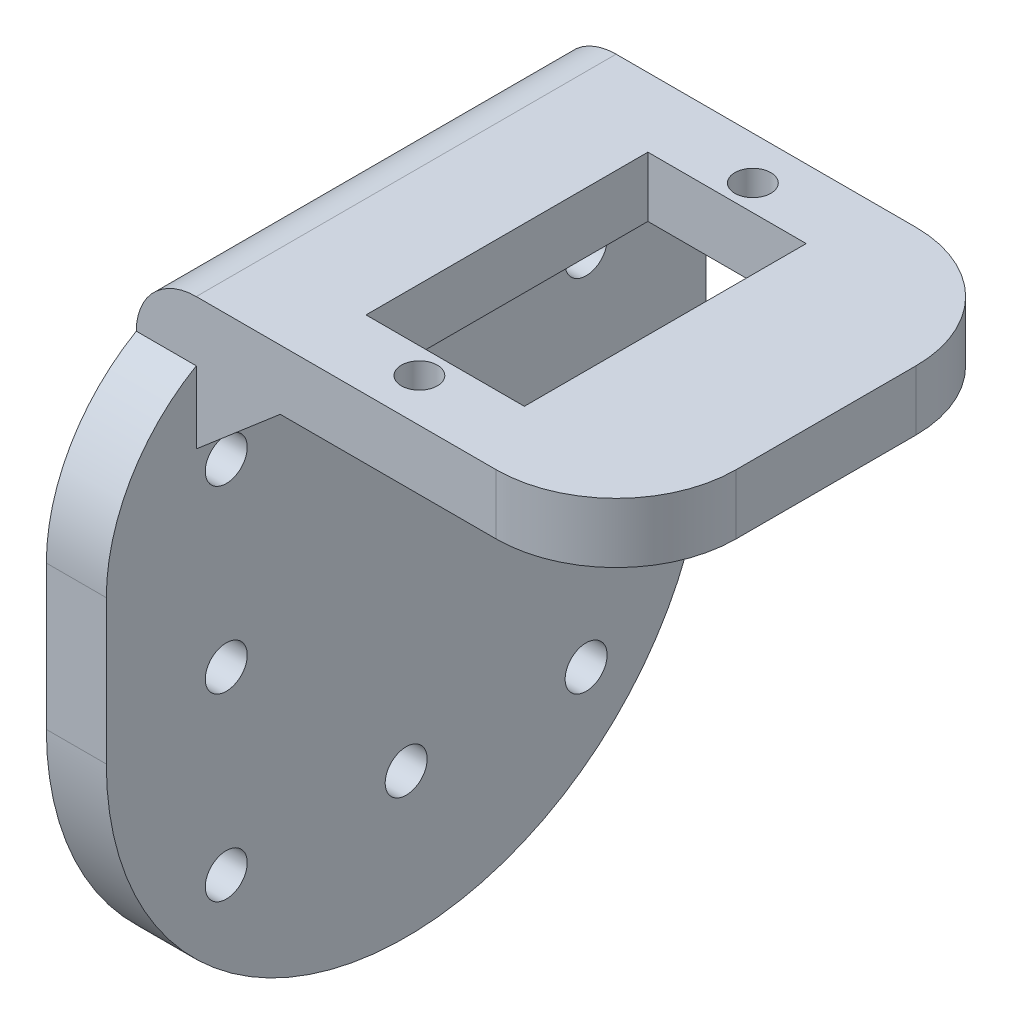
ISO-10303-21;
HEADER;
FILE_DESCRIPTION(('STEP AP214'),'2;1');
FILE_NAME('part.step','',(''),(''),'','','');
FILE_SCHEMA(('AUTOMOTIVE_DESIGN { 1 0 10303 214 1 1 1 1 }'));
ENDSEC;
DATA;
#1=APPLICATION_CONTEXT('core data for automotive mechanical design processes');
#2=APPLICATION_PROTOCOL_DEFINITION('international standard','automotive_design',2000,#1);
#3=PRODUCT_CONTEXT('',#1,'mechanical');
#4=PRODUCT('Part','Part','',(#3));
#5=PRODUCT_RELATED_PRODUCT_CATEGORY('part','',(#4));
#6=PRODUCT_DEFINITION_FORMATION('','',#4);
#7=PRODUCT_DEFINITION_CONTEXT('part definition',#1,'design');
#8=PRODUCT_DEFINITION('design','',#6,#7);
#9=PRODUCT_DEFINITION_SHAPE('','',#8);
#10=(LENGTH_UNIT() NAMED_UNIT(*) SI_UNIT(.MILLI.,.METRE.));
#11=(NAMED_UNIT(*) PLANE_ANGLE_UNIT() SI_UNIT($,.RADIAN.));
#12=(NAMED_UNIT(*) SI_UNIT($,.STERADIAN.) SOLID_ANGLE_UNIT());
#13=UNCERTAINTY_MEASURE_WITH_UNIT(LENGTH_MEASURE(1.E-05),#10,'distance_accuracy_value','');
#14=(GEOMETRIC_REPRESENTATION_CONTEXT(3) GLOBAL_UNCERTAINTY_ASSIGNED_CONTEXT((#13)) GLOBAL_UNIT_ASSIGNED_CONTEXT((#10,
#11,#12)) REPRESENTATION_CONTEXT('',''));
#15=CARTESIAN_POINT('',(0.,0.,0.));
#16=DIRECTION('',(0.,0.,1.));
#17=DIRECTION('',(1.,0.,0.));
#18=AXIS2_PLACEMENT_3D('',#15,#16,#17);
#19=CARTESIAN_POINT('',(5.,0.,0.));
#20=DIRECTION('',(1.,0.,0.));
#21=DIRECTION('',(0.,0.,-1.));
#22=AXIS2_PLACEMENT_3D('',#19,#20,#21);
#23=PLANE('',#22);
#24=CARTESIAN_POINT('',(5.,4.5,0.));
#25=DIRECTION('',(1.,0.,0.));
#26=DIRECTION('',(0.,0.,-1.));
#27=AXIS2_PLACEMENT_3D('',#24,#25,#26);
#28=CIRCLE('',#27,1.75);
#29=CARTESIAN_POINT('',(5.,4.5,-1.75));
#30=VERTEX_POINT('',#29);
#31=EDGE_CURVE('E303',#30,#30,#28,.T.);
#32=ORIENTED_EDGE('',*,*,#31,.F.);
#33=EDGE_LOOP('',(#32));
#34=FACE_BOUND('',#33,.T.);
#35=CARTESIAN_POINT('',(5.,4.5,15.));
#36=DIRECTION('',(1.,0.,0.));
#37=DIRECTION('',(0.,0.,-1.));
#38=AXIS2_PLACEMENT_3D('',#35,#36,#37);
#39=CIRCLE('',#38,1.75);
#40=CARTESIAN_POINT('',(5.,4.5,13.25));
#41=VERTEX_POINT('',#40);
#42=EDGE_CURVE('E304',#41,#41,#39,.T.);
#43=ORIENTED_EDGE('',*,*,#42,.F.);
#44=EDGE_LOOP('',(#43));
#45=FACE_BOUND('',#44,.T.);
#46=CARTESIAN_POINT('',(5.,-10.5,-15.));
#47=DIRECTION('',(1.,0.,0.));
#48=DIRECTION('',(0.,0.,-1.));
#49=AXIS2_PLACEMENT_3D('',#46,#47,#48);
#50=CIRCLE('',#49,1.75);
#51=CARTESIAN_POINT('',(5.,-10.5,-16.75));
#52=VERTEX_POINT('',#51);
#53=EDGE_CURVE('E311',#52,#52,#50,.T.);
#54=ORIENTED_EDGE('',*,*,#53,.F.);
#55=EDGE_LOOP('',(#54));
#56=FACE_BOUND('',#55,.T.);
#57=CARTESIAN_POINT('',(5.,-25.5,0.));
#58=DIRECTION('',(1.,0.,0.));
#59=DIRECTION('',(0.,0.,-1.));
#60=AXIS2_PLACEMENT_3D('',#57,#58,#59);
#61=CIRCLE('',#60,1.75);
#62=CARTESIAN_POINT('',(5.,-25.5,-1.75));
#63=VERTEX_POINT('',#62);
#64=EDGE_CURVE('E317',#63,#63,#61,.T.);
#65=ORIENTED_EDGE('',*,*,#64,.F.);
#66=EDGE_LOOP('',(#65));
#67=FACE_BOUND('',#66,.T.);
#68=CARTESIAN_POINT('',(5.,-10.5,15.));
#69=DIRECTION('',(1.,0.,0.));
#70=DIRECTION('',(0.,0.,-1.));
#71=AXIS2_PLACEMENT_3D('',#68,#69,#70);
#72=CIRCLE('',#71,1.75);
#73=CARTESIAN_POINT('',(5.,-10.5,13.25));
#74=VERTEX_POINT('',#73);
#75=EDGE_CURVE('E285',#74,#74,#72,.T.);
#76=ORIENTED_EDGE('',*,*,#75,.F.);
#77=EDGE_LOOP('',(#76));
#78=FACE_BOUND('',#77,.T.);
#79=CARTESIAN_POINT('',(5.,-25.5,15.));
#80=DIRECTION('',(1.,0.,0.));
#81=DIRECTION('',(0.,0.,-1.));
#82=AXIS2_PLACEMENT_3D('',#79,#80,#81);
#83=CIRCLE('',#82,1.75);
#84=CARTESIAN_POINT('',(5.,-25.5,13.25));
#85=VERTEX_POINT('',#84);
#86=EDGE_CURVE('E286',#85,#85,#83,.T.);
#87=ORIENTED_EDGE('',*,*,#86,.F.);
#88=EDGE_LOOP('',(#87));
#89=FACE_BOUND('',#88,.T.);
#90=CARTESIAN_POINT('',(5.,-25.5,-15.));
#91=DIRECTION('',(1.,0.,0.));
#92=DIRECTION('',(0.,0.,-1.));
#93=AXIS2_PLACEMENT_3D('',#90,#91,#92);
#94=CIRCLE('',#93,1.75);
#95=CARTESIAN_POINT('',(5.,-25.5,-16.75));
#96=VERTEX_POINT('',#95);
#97=EDGE_CURVE('E293',#96,#96,#94,.T.);
#98=ORIENTED_EDGE('',*,*,#97,.F.);
#99=EDGE_LOOP('',(#98));
#100=FACE_BOUND('',#99,.T.);
#101=CARTESIAN_POINT('',(5.,4.5,-15.));
#102=DIRECTION('',(1.,0.,0.));
#103=DIRECTION('',(0.,0.,-1.));
#104=AXIS2_PLACEMENT_3D('',#101,#102,#103);
#105=CIRCLE('',#104,1.75);
#106=CARTESIAN_POINT('',(5.,4.5,-16.75));
#107=VERTEX_POINT('',#106);
#108=EDGE_CURVE('E307',#107,#107,#105,.T.);
#109=ORIENTED_EDGE('',*,*,#108,.F.);
#110=EDGE_LOOP('',(#109));
#111=FACE_BOUND('',#110,.T.);
#112=DIRECTION('',(0.,0.,1.));
#113=VECTOR('',#112,1.);
#114=CARTESIAN_POINT('',(5.,12.5,0.));
#115=LINE('',#114,#113);
#116=CARTESIAN_POINT('',(5.,12.5,-11.5));
#117=VERTEX_POINT('',#116);
#118=CARTESIAN_POINT('',(5.,12.5,11.5));
#119=VERTEX_POINT('',#118);
#120=EDGE_CURVE('E338',#117,#119,#115,.T.);
#121=ORIENTED_EDGE('',*,*,#120,.T.);
#122=DIRECTION('',(0.,1.,0.));
#123=VECTOR('',#122,1.);
#124=CARTESIAN_POINT('',(5.,6.5,11.5));
#125=LINE('',#124,#123);
#126=CARTESIAN_POINT('',(5.,6.5,11.5));
#127=VERTEX_POINT('',#126);
#128=EDGE_CURVE('E179',#127,#119,#125,.T.);
#129=ORIENTED_EDGE('',*,*,#128,.F.);
#130=DIRECTION('',(0.,0.,1.));
#131=VECTOR('',#130,1.);
#132=CARTESIAN_POINT('',(5.,6.5,11.5));
#133=LINE('',#132,#131);
#134=CARTESIAN_POINT('',(5.,6.5,17.5));
#135=VERTEX_POINT('',#134);
#136=EDGE_CURVE('E190',#127,#135,#133,.T.);
#137=ORIENTED_EDGE('',*,*,#136,.T.);
#138=DIRECTION('',(0.,1.,0.));
#139=VECTOR('',#138,1.);
#140=CARTESIAN_POINT('',(5.,6.5,17.5));
#141=LINE('',#140,#139);
#142=CARTESIAN_POINT('',(5.,12.5,17.5));
#143=VERTEX_POINT('',#142);
#144=EDGE_CURVE('E191',#135,#143,#141,.T.);
#145=ORIENTED_EDGE('',*,*,#144,.T.);
#146=CARTESIAN_POINT('',(5.,-0.490381056766588,10.));
#147=DIRECTION('',(1.,0.,0.));
#148=DIRECTION('',(0.,0.,-1.));
#149=AXIS2_PLACEMENT_3D('',#146,#147,#148);
#150=CIRCLE('',#149,15.);
#151=CARTESIAN_POINT('',(5.,-0.490381056766588,25.));
#152=VERTEX_POINT('',#151);
#153=EDGE_CURVE('E45',#143,#152,#150,.T.);
#154=ORIENTED_EDGE('',*,*,#153,.T.);
#155=DIRECTION('',(0.,1.,0.));
#156=VECTOR('',#155,1.);
#157=CARTESIAN_POINT('',(5.,0.,25.));
#158=LINE('',#157,#156);
#159=CARTESIAN_POINT('',(5.,-12.5,25.));
#160=VERTEX_POINT('',#159);
#161=EDGE_CURVE('E330',#160,#152,#158,.T.);
#162=ORIENTED_EDGE('',*,*,#161,.F.);
#163=CARTESIAN_POINT('',(5.,-12.5,0.));
#164=DIRECTION('',(1.,0.,0.));
#165=DIRECTION('',(0.,0.,-1.));
#166=AXIS2_PLACEMENT_3D('',#163,#164,#165);
#167=CIRCLE('',#166,25.);
#168=CARTESIAN_POINT('',(5.,-12.5,-25.));
#169=VERTEX_POINT('',#168);
#170=EDGE_CURVE('E333',#160,#169,#167,.T.);
#171=ORIENTED_EDGE('',*,*,#170,.T.);
#172=DIRECTION('',(0.,1.,0.));
#173=VECTOR('',#172,1.);
#174=CARTESIAN_POINT('',(5.,0.,-25.));
#175=LINE('',#174,#173);
#176=CARTESIAN_POINT('',(5.,-0.490381056766574,-25.));
#177=VERTEX_POINT('',#176);
#178=EDGE_CURVE('E336',#169,#177,#175,.T.);
#179=ORIENTED_EDGE('',*,*,#178,.T.);
#180=CARTESIAN_POINT('',(5.,-0.490381056766574,-9.99999999999999));
#181=DIRECTION('',(1.,0.,0.));
#182=DIRECTION('',(0.,0.,-1.));
#183=AXIS2_PLACEMENT_3D('',#180,#181,#182);
#184=CIRCLE('',#183,15.);
#185=CARTESIAN_POINT('',(5.,12.5,-17.5));
#186=VERTEX_POINT('',#185);
#187=EDGE_CURVE('E387',#177,#186,#184,.T.);
#188=ORIENTED_EDGE('',*,*,#187,.T.);
#189=DIRECTION('',(0.,1.,0.));
#190=VECTOR('',#189,1.);
#191=CARTESIAN_POINT('',(5.,6.5,-17.5));
#192=LINE('',#191,#190);
#193=CARTESIAN_POINT('',(5.,6.5,-17.5));
#194=VERTEX_POINT('',#193);
#195=EDGE_CURVE('E206',#194,#186,#192,.T.);
#196=ORIENTED_EDGE('',*,*,#195,.F.);
#197=DIRECTION('',(0.,0.,-1.));
#198=VECTOR('',#197,1.);
#199=CARTESIAN_POINT('',(5.,6.5,-11.5));
#200=LINE('',#199,#198);
#201=CARTESIAN_POINT('',(5.,6.5,-11.5));
#202=VERTEX_POINT('',#201);
#203=EDGE_CURVE('E212',#202,#194,#200,.T.);
#204=ORIENTED_EDGE('',*,*,#203,.F.);
#205=DIRECTION('',(0.,1.,0.));
#206=VECTOR('',#205,1.);
#207=CARTESIAN_POINT('',(5.,6.5,-11.5));
#208=LINE('',#207,#206);
#209=EDGE_CURVE('E205',#202,#117,#208,.T.);
#210=ORIENTED_EDGE('',*,*,#209,.T.);
#211=EDGE_LOOP('',(#121,#129,#137,#145,#154,#162,#171,#179,#188,#196,#204,#210));
#212=FACE_BOUND('',#211,.T.);
#213=ADVANCED_FACE('F37',(#34,#45,#56,#67,#78,#89,#100,#111,#212),#23,.T.);
#214=CARTESIAN_POINT('',(0.,12.5,0.));
#215=DIRECTION('',(0.,1.,0.));
#216=DIRECTION('',(0.,0.,1.));
#217=AXIS2_PLACEMENT_3D('',#214,#215,#216);
#218=PLANE('',#217);
#219=CARTESIAN_POINT('',(20.,12.5,13.9));
#220=DIRECTION('',(0.,1.,0.));
#221=DIRECTION('',(0.,0.,1.));
#222=AXIS2_PLACEMENT_3D('',#219,#220,#221);
#223=CIRCLE('',#222,1.5);
#224=CARTESIAN_POINT('',(20.,12.5,15.4));
#225=VERTEX_POINT('',#224);
#226=EDGE_CURVE('E231',#225,#225,#223,.F.);
#227=ORIENTED_EDGE('',*,*,#226,.F.);
#228=EDGE_LOOP('',(#227));
#229=FACE_BOUND('',#228,.T.);
#230=DIRECTION('',(0.,0.,-1.));
#231=VECTOR('',#230,1.);
#232=CARTESIAN_POINT('',(13.4,12.5,-11.75));
#233=LINE('',#232,#231);
#234=CARTESIAN_POINT('',(13.4,12.5,11.75));
#235=VERTEX_POINT('',#234);
#236=CARTESIAN_POINT('',(13.4,12.5,-11.75));
#237=VERTEX_POINT('',#236);
#238=EDGE_CURVE('E230',#235,#237,#233,.T.);
#239=ORIENTED_EDGE('',*,*,#238,.F.);
#240=DIRECTION('',(-1.,0.,0.));
#241=VECTOR('',#240,1.);
#242=CARTESIAN_POINT('',(26.6,12.5,11.75));
#243=LINE('',#242,#241);
#244=CARTESIAN_POINT('',(26.6,12.5,11.75));
#245=VERTEX_POINT('',#244);
#246=EDGE_CURVE('E234',#245,#235,#243,.T.);
#247=ORIENTED_EDGE('',*,*,#246,.F.);
#248=DIRECTION('',(0.,0.,1.));
#249=VECTOR('',#248,1.);
#250=CARTESIAN_POINT('',(26.6,12.5,-11.75));
#251=LINE('',#250,#249);
#252=CARTESIAN_POINT('',(26.6,12.5,-11.75));
#253=VERTEX_POINT('',#252);
#254=EDGE_CURVE('E225',#253,#245,#251,.T.);
#255=ORIENTED_EDGE('',*,*,#254,.F.);
#256=DIRECTION('',(1.,0.,0.));
#257=VECTOR('',#256,1.);
#258=CARTESIAN_POINT('',(26.6,12.5,-11.75));
#259=LINE('',#258,#257);
#260=EDGE_CURVE('E228',#237,#253,#259,.T.);
#261=ORIENTED_EDGE('',*,*,#260,.F.);
#262=EDGE_LOOP('',(#239,#247,#255,#261));
#263=FACE_BOUND('',#262,.T.);
#264=CARTESIAN_POINT('',(20.,12.5,-13.9));
#265=DIRECTION('',(0.,1.,0.));
#266=DIRECTION('',(0.,0.,1.));
#267=AXIS2_PLACEMENT_3D('',#264,#265,#266);
#268=CIRCLE('',#267,1.5);
#269=CARTESIAN_POINT('',(20.,12.5,-12.4));
#270=VERTEX_POINT('',#269);
#271=EDGE_CURVE('E224',#270,#270,#268,.F.);
#272=ORIENTED_EDGE('',*,*,#271,.F.);
#273=EDGE_LOOP('',(#272));
#274=FACE_BOUND('',#273,.T.);
#275=DIRECTION('',(0.,0.,1.));
#276=VECTOR('',#275,1.);
#277=CARTESIAN_POINT('',(12.,12.5,11.5));
#278=LINE('',#277,#276);
#279=CARTESIAN_POINT('',(12.,12.5,11.5));
#280=VERTEX_POINT('',#279);
#281=CARTESIAN_POINT('',(12.,12.5,17.5));
#282=VERTEX_POINT('',#281);
#283=EDGE_CURVE('E187',#280,#282,#278,.T.);
#284=ORIENTED_EDGE('',*,*,#283,.F.);
#285=DIRECTION('',(1.,0.,0.));
#286=VECTOR('',#285,1.);
#287=CARTESIAN_POINT('',(5.,12.5,11.5));
#288=LINE('',#287,#286);
#289=EDGE_CURVE('E173',#119,#280,#288,.T.);
#290=ORIENTED_EDGE('',*,*,#289,.F.);
#291=ORIENTED_EDGE('',*,*,#120,.F.);
#292=DIRECTION('',(1.,0.,0.));
#293=VECTOR('',#292,1.);
#294=CARTESIAN_POINT('',(5.,12.5,-11.5));
#295=LINE('',#294,#293);
#296=CARTESIAN_POINT('',(12.,12.5,-11.5));
#297=VERTEX_POINT('',#296);
#298=EDGE_CURVE('E209',#117,#297,#295,.T.);
#299=ORIENTED_EDGE('',*,*,#298,.T.);
#300=DIRECTION('',(0.,0.,-1.));
#301=VECTOR('',#300,1.);
#302=CARTESIAN_POINT('',(12.,12.5,-11.5));
#303=LINE('',#302,#301);
#304=CARTESIAN_POINT('',(12.,12.5,-17.5));
#305=VERTEX_POINT('',#304);
#306=EDGE_CURVE('E216',#297,#305,#303,.T.);
#307=ORIENTED_EDGE('',*,*,#306,.T.);
#308=DIRECTION('',(-1.,0.,0.));
#309=VECTOR('',#308,1.);
#310=CARTESIAN_POINT('',(0.,12.5,-17.5));
#311=LINE('',#310,#309);
#312=CARTESIAN_POINT('',(30.,12.5,-17.5));
#313=VERTEX_POINT('',#312);
#314=EDGE_CURVE('E266',#313,#305,#311,.T.);
#315=ORIENTED_EDGE('',*,*,#314,.F.);
#316=CARTESIAN_POINT('',(30.,12.5,-7.5));
#317=DIRECTION('',(0.,1.,0.));
#318=DIRECTION('',(0.,0.,1.));
#319=AXIS2_PLACEMENT_3D('',#316,#317,#318);
#320=CIRCLE('',#319,10.);
#321=CARTESIAN_POINT('',(40.,12.5,-7.5));
#322=VERTEX_POINT('',#321);
#323=EDGE_CURVE('E355',#313,#322,#320,.F.);
#324=ORIENTED_EDGE('',*,*,#323,.T.);
#325=DIRECTION('',(0.,0.,-1.));
#326=VECTOR('',#325,1.);
#327=CARTESIAN_POINT('',(40.,12.5,-17.5));
#328=LINE('',#327,#326);
#329=CARTESIAN_POINT('',(40.,12.5,7.5));
#330=VERTEX_POINT('',#329);
#331=EDGE_CURVE('E276',#330,#322,#328,.T.);
#332=ORIENTED_EDGE('',*,*,#331,.F.);
#333=CARTESIAN_POINT('',(30.,12.5,7.5));
#334=DIRECTION('',(0.,1.,0.));
#335=DIRECTION('',(0.,0.,1.));
#336=AXIS2_PLACEMENT_3D('',#333,#334,#335);
#337=CIRCLE('',#336,10.);
#338=CARTESIAN_POINT('',(30.,12.5,17.5));
#339=VERTEX_POINT('',#338);
#340=EDGE_CURVE('E353',#330,#339,#337,.F.);
#341=ORIENTED_EDGE('',*,*,#340,.T.);
#342=DIRECTION('',(1.,0.,0.));
#343=VECTOR('',#342,1.);
#344=CARTESIAN_POINT('',(0.,12.5,17.5));
#345=LINE('',#344,#343);
#346=EDGE_CURVE('E195',#282,#339,#345,.T.);
#347=ORIENTED_EDGE('',*,*,#346,.F.);
#348=EDGE_LOOP('',(#284,#290,#291,#299,#307,#315,#324,#332,#341,#347));
#349=FACE_BOUND('',#348,.T.);
#350=ADVANCED_FACE('F193',(#229,#263,#274,#349),#218,.F.);
#351=CARTESIAN_POINT('',(5.,0.,25.));
#352=DIRECTION('',(0.,0.,1.));
#353=DIRECTION('',(1.,0.,0.));
#354=AXIS2_PLACEMENT_3D('',#351,#352,#353);
#355=PLANE('',#354);
#356=ORIENTED_EDGE('',*,*,#161,.T.);
#357=DIRECTION('',(-1.,0.,0.));
#358=VECTOR('',#357,1.);
#359=CARTESIAN_POINT('',(0.,-0.490381056766588,25.));
#360=LINE('',#359,#358);
#361=CARTESIAN_POINT('',(0.,-0.490381056766588,25.));
#362=VERTEX_POINT('',#361);
#363=EDGE_CURVE('E380',#152,#362,#360,.T.);
#364=ORIENTED_EDGE('',*,*,#363,.T.);
#365=DIRECTION('',(0.,1.,0.));
#366=VECTOR('',#365,1.);
#367=CARTESIAN_POINT('',(0.,0.,25.));
#368=LINE('',#367,#366);
#369=CARTESIAN_POINT('',(0.,-12.5,25.));
#370=VERTEX_POINT('',#369);
#371=EDGE_CURVE('E329',#370,#362,#368,.T.);
#372=ORIENTED_EDGE('',*,*,#371,.F.);
#373=DIRECTION('',(-1.,0.,0.));
#374=VECTOR('',#373,1.);
#375=CARTESIAN_POINT('',(5.,-12.5,25.));
#376=LINE('',#375,#374);
#377=EDGE_CURVE('E348',#160,#370,#376,.T.);
#378=ORIENTED_EDGE('',*,*,#377,.F.);
#379=EDGE_LOOP('',(#356,#364,#372,#378));
#380=FACE_BOUND('',#379,.T.);
#381=ADVANCED_FACE('F396',(#380),#355,.T.);
#382=CARTESIAN_POINT('',(5.,-12.5,0.));
#383=DIRECTION('',(-1.,0.,0.));
#384=DIRECTION('',(0.,0.,1.));
#385=AXIS2_PLACEMENT_3D('',#382,#383,#384);
#386=CYLINDRICAL_SURFACE('',#385,25.);
#387=CARTESIAN_POINT('',(0.,-12.5,0.));
#388=DIRECTION('',(1.,0.,0.));
#389=DIRECTION('',(0.,0.,-1.));
#390=AXIS2_PLACEMENT_3D('',#387,#388,#389);
#391=CIRCLE('',#390,25.);
#392=CARTESIAN_POINT('',(0.,-12.5,-25.));
#393=VERTEX_POINT('',#392);
#394=EDGE_CURVE('E343',#370,#393,#391,.T.);
#395=ORIENTED_EDGE('',*,*,#394,.T.);
#396=DIRECTION('',(-1.,0.,0.));
#397=VECTOR('',#396,1.);
#398=CARTESIAN_POINT('',(5.,-12.5,-25.));
#399=LINE('',#398,#397);
#400=EDGE_CURVE('E340',#169,#393,#399,.T.);
#401=ORIENTED_EDGE('',*,*,#400,.F.);
#402=ORIENTED_EDGE('',*,*,#170,.F.);
#403=ORIENTED_EDGE('',*,*,#377,.T.);
#404=EDGE_LOOP('',(#395,#401,#402,#403));
#405=FACE_BOUND('',#404,.T.);
#406=ADVANCED_FACE('F438',(#405),#386,.T.);
#407=CARTESIAN_POINT('',(5.,0.,-25.));
#408=DIRECTION('',(0.,0.,1.));
#409=DIRECTION('',(1.,0.,0.));
#410=AXIS2_PLACEMENT_3D('',#407,#408,#409);
#411=PLANE('',#410);
#412=DIRECTION('',(0.,1.,0.));
#413=VECTOR('',#412,1.);
#414=CARTESIAN_POINT('',(0.,0.,-25.));
#415=LINE('',#414,#413);
#416=CARTESIAN_POINT('',(0.,-0.490381056766574,-25.));
#417=VERTEX_POINT('',#416);
#418=EDGE_CURVE('E334',#393,#417,#415,.T.);
#419=ORIENTED_EDGE('',*,*,#418,.T.);
#420=DIRECTION('',(-1.,0.,0.));
#421=VECTOR('',#420,1.);
#422=CARTESIAN_POINT('',(5.,-0.490381056766574,-25.));
#423=LINE('',#422,#421);
#424=EDGE_CURVE('E11',#417,#177,#423,.F.);
#425=ORIENTED_EDGE('',*,*,#424,.T.);
#426=ORIENTED_EDGE('',*,*,#178,.F.);
#427=ORIENTED_EDGE('',*,*,#400,.T.);
#428=EDGE_LOOP('',(#419,#425,#426,#427));
#429=FACE_BOUND('',#428,.T.);
#430=ADVANCED_FACE('F435',(#429),#411,.F.);
#431=CARTESIAN_POINT('',(0.,0.,0.));
#432=DIRECTION('',(1.,0.,0.));
#433=DIRECTION('',(0.,0.,-1.));
#434=AXIS2_PLACEMENT_3D('',#431,#432,#433);
#435=PLANE('',#434);
#436=CARTESIAN_POINT('',(0.,4.5,0.));
#437=DIRECTION('',(1.,0.,0.));
#438=DIRECTION('',(0.,0.,-1.));
#439=AXIS2_PLACEMENT_3D('',#436,#437,#438);
#440=CIRCLE('',#439,1.75);
#441=CARTESIAN_POINT('',(0.,4.5,-1.75));
#442=VERTEX_POINT('',#441);
#443=EDGE_CURVE('E300',#442,#442,#440,.F.);
#444=ORIENTED_EDGE('',*,*,#443,.F.);
#445=EDGE_LOOP('',(#444));
#446=FACE_BOUND('',#445,.T.);
#447=CARTESIAN_POINT('',(0.,4.5,15.));
#448=DIRECTION('',(1.,0.,0.));
#449=DIRECTION('',(0.,0.,-1.));
#450=AXIS2_PLACEMENT_3D('',#447,#448,#449);
#451=CIRCLE('',#450,1.75);
#452=CARTESIAN_POINT('',(0.,4.5,13.25));
#453=VERTEX_POINT('',#452);
#454=EDGE_CURVE('E308',#453,#453,#451,.F.);
#455=ORIENTED_EDGE('',*,*,#454,.F.);
#456=EDGE_LOOP('',(#455));
#457=FACE_BOUND('',#456,.T.);
#458=CARTESIAN_POINT('',(0.,-10.5,-15.));
#459=DIRECTION('',(1.,0.,0.));
#460=DIRECTION('',(0.,0.,-1.));
#461=AXIS2_PLACEMENT_3D('',#458,#459,#460);
#462=CIRCLE('',#461,1.75);
#463=CARTESIAN_POINT('',(0.,-10.5,-16.75));
#464=VERTEX_POINT('',#463);
#465=EDGE_CURVE('E314',#464,#464,#462,.F.);
#466=ORIENTED_EDGE('',*,*,#465,.F.);
#467=EDGE_LOOP('',(#466));
#468=FACE_BOUND('',#467,.T.);
#469=CARTESIAN_POINT('',(0.,-25.5,0.));
#470=DIRECTION('',(1.,0.,0.));
#471=DIRECTION('',(0.,0.,-1.));
#472=AXIS2_PLACEMENT_3D('',#469,#470,#471);
#473=CIRCLE('',#472,1.75);
#474=CARTESIAN_POINT('',(0.,-25.5,-1.75));
#475=VERTEX_POINT('',#474);
#476=EDGE_CURVE('E289',#475,#475,#473,.F.);
#477=ORIENTED_EDGE('',*,*,#476,.F.);
#478=EDGE_LOOP('',(#477));
#479=FACE_BOUND('',#478,.T.);
#480=CARTESIAN_POINT('',(0.,-10.5,15.));
#481=DIRECTION('',(1.,0.,0.));
#482=DIRECTION('',(0.,0.,-1.));
#483=AXIS2_PLACEMENT_3D('',#480,#481,#482);
#484=CIRCLE('',#483,1.75);
#485=CARTESIAN_POINT('',(0.,-10.5,13.25));
#486=VERTEX_POINT('',#485);
#487=EDGE_CURVE('E282',#486,#486,#484,.F.);
#488=ORIENTED_EDGE('',*,*,#487,.F.);
#489=EDGE_LOOP('',(#488));
#490=FACE_BOUND('',#489,.T.);
#491=CARTESIAN_POINT('',(0.,-25.5,15.));
#492=DIRECTION('',(1.,0.,0.));
#493=DIRECTION('',(0.,0.,-1.));
#494=AXIS2_PLACEMENT_3D('',#491,#492,#493);
#495=CIRCLE('',#494,1.75);
#496=CARTESIAN_POINT('',(0.,-25.5,13.25));
#497=VERTEX_POINT('',#496);
#498=EDGE_CURVE('E290',#497,#497,#495,.F.);
#499=ORIENTED_EDGE('',*,*,#498,.F.);
#500=EDGE_LOOP('',(#499));
#501=FACE_BOUND('',#500,.T.);
#502=CARTESIAN_POINT('',(0.,-25.5,-15.));
#503=DIRECTION('',(1.,0.,0.));
#504=DIRECTION('',(0.,0.,-1.));
#505=AXIS2_PLACEMENT_3D('',#502,#503,#504);
#506=CIRCLE('',#505,1.75);
#507=CARTESIAN_POINT('',(0.,-25.5,-16.75));
#508=VERTEX_POINT('',#507);
#509=EDGE_CURVE('E272',#508,#508,#506,.F.);
#510=ORIENTED_EDGE('',*,*,#509,.F.);
#511=EDGE_LOOP('',(#510));
#512=FACE_BOUND('',#511,.T.);
#513=CARTESIAN_POINT('',(0.,4.5,-15.));
#514=DIRECTION('',(1.,0.,0.));
#515=DIRECTION('',(0.,0.,-1.));
#516=AXIS2_PLACEMENT_3D('',#513,#514,#515);
#517=CIRCLE('',#516,1.75);
#518=CARTESIAN_POINT('',(0.,4.5,-16.75));
#519=VERTEX_POINT('',#518);
#520=EDGE_CURVE('E326',#519,#519,#517,.F.);
#521=ORIENTED_EDGE('',*,*,#520,.F.);
#522=EDGE_LOOP('',(#521));
#523=FACE_BOUND('',#522,.T.);
#524=ORIENTED_EDGE('',*,*,#371,.T.);
#525=CARTESIAN_POINT('',(0.,-0.490381056766588,10.));
#526=DIRECTION('',(1.,0.,0.));
#527=DIRECTION('',(0.,0.,-1.));
#528=AXIS2_PLACEMENT_3D('',#525,#526,#527);
#529=CIRCLE('',#528,15.);
#530=CARTESIAN_POINT('',(0.,12.5,17.5));
#531=VERTEX_POINT('',#530);
#532=EDGE_CURVE('E385',#362,#531,#529,.F.);
#533=ORIENTED_EDGE('',*,*,#532,.T.);
#534=DIRECTION('',(0.,0.,1.));
#535=VECTOR('',#534,1.);
#536=CARTESIAN_POINT('',(0.,12.5,-17.5));
#537=LINE('',#536,#535);
#538=CARTESIAN_POINT('',(0.,12.5,-17.5));
#539=VERTEX_POINT('',#538);
#540=EDGE_CURVE('E375',#531,#539,#537,.F.);
#541=ORIENTED_EDGE('',*,*,#540,.T.);
#542=CARTESIAN_POINT('',(0.,-0.490381056766574,-9.99999999999999));
#543=DIRECTION('',(1.,0.,0.));
#544=DIRECTION('',(0.,0.,-1.));
#545=AXIS2_PLACEMENT_3D('',#542,#543,#544);
#546=CIRCLE('',#545,15.);
#547=EDGE_CURVE('E383',#539,#417,#546,.F.);
#548=ORIENTED_EDGE('',*,*,#547,.T.);
#549=ORIENTED_EDGE('',*,*,#418,.F.);
#550=ORIENTED_EDGE('',*,*,#394,.F.);
#551=EDGE_LOOP('',(#524,#533,#541,#548,#549,#550));
#552=FACE_BOUND('',#551,.T.);
#553=ADVANCED_FACE('F401',(#446,#457,#468,#479,#490,#501,#512,#523,#552),#435,.F.);
#554=CARTESIAN_POINT('',(-0.00100000000000013,4.5,-15.));
#555=DIRECTION('',(1.,0.,0.));
#556=DIRECTION('',(0.,0.,-1.));
#557=AXIS2_PLACEMENT_3D('',#554,#555,#556);
#558=CYLINDRICAL_SURFACE('',#557,1.75);
#559=ORIENTED_EDGE('',*,*,#108,.T.);
#560=EDGE_LOOP('',(#559));
#561=FACE_BOUND('',#560,.T.);
#562=ORIENTED_EDGE('',*,*,#520,.T.);
#563=EDGE_LOOP('',(#562));
#564=FACE_BOUND('',#563,.T.);
#565=ADVANCED_FACE('F459',(#561,#564),#558,.F.);
#566=CARTESIAN_POINT('',(-0.00100000000000013,-25.5,-15.));
#567=DIRECTION('',(1.,0.,0.));
#568=DIRECTION('',(0.,0.,-1.));
#569=AXIS2_PLACEMENT_3D('',#566,#567,#568);
#570=CYLINDRICAL_SURFACE('',#569,1.75);
#571=ORIENTED_EDGE('',*,*,#97,.T.);
#572=EDGE_LOOP('',(#571));
#573=FACE_BOUND('',#572,.T.);
#574=ORIENTED_EDGE('',*,*,#509,.T.);
#575=EDGE_LOOP('',(#574));
#576=FACE_BOUND('',#575,.T.);
#577=ADVANCED_FACE('F466',(#573,#576),#570,.F.);
#578=CARTESIAN_POINT('',(-0.00100000000000013,-25.5,15.));
#579=DIRECTION('',(1.,0.,0.));
#580=DIRECTION('',(0.,0.,-1.));
#581=AXIS2_PLACEMENT_3D('',#578,#579,#580);
#582=CYLINDRICAL_SURFACE('',#581,1.75);
#583=ORIENTED_EDGE('',*,*,#86,.T.);
#584=EDGE_LOOP('',(#583));
#585=FACE_BOUND('',#584,.T.);
#586=ORIENTED_EDGE('',*,*,#498,.T.);
#587=EDGE_LOOP('',(#586));
#588=FACE_BOUND('',#587,.T.);
#589=ADVANCED_FACE('F486',(#585,#588),#582,.F.);
#590=CARTESIAN_POINT('',(-0.00100000000000013,-10.5,15.));
#591=DIRECTION('',(1.,0.,0.));
#592=DIRECTION('',(0.,0.,-1.));
#593=AXIS2_PLACEMENT_3D('',#590,#591,#592);
#594=CYLINDRICAL_SURFACE('',#593,1.75);
#595=ORIENTED_EDGE('',*,*,#75,.T.);
#596=EDGE_LOOP('',(#595));
#597=FACE_BOUND('',#596,.T.);
#598=ORIENTED_EDGE('',*,*,#487,.T.);
#599=EDGE_LOOP('',(#598));
#600=FACE_BOUND('',#599,.T.);
#601=ADVANCED_FACE('F492',(#597,#600),#594,.F.);
#602=CARTESIAN_POINT('',(-0.00100000000000013,-25.5,0.));
#603=DIRECTION('',(1.,0.,0.));
#604=DIRECTION('',(0.,0.,-1.));
#605=AXIS2_PLACEMENT_3D('',#602,#603,#604);
#606=CYLINDRICAL_SURFACE('',#605,1.75);
#607=ORIENTED_EDGE('',*,*,#64,.T.);
#608=EDGE_LOOP('',(#607));
#609=FACE_BOUND('',#608,.T.);
#610=ORIENTED_EDGE('',*,*,#476,.T.);
#611=EDGE_LOOP('',(#610));
#612=FACE_BOUND('',#611,.T.);
#613=ADVANCED_FACE('F507',(#609,#612),#606,.F.);
#614=CARTESIAN_POINT('',(-0.00100000000000013,-10.5,-15.));
#615=DIRECTION('',(1.,0.,0.));
#616=DIRECTION('',(0.,0.,-1.));
#617=AXIS2_PLACEMENT_3D('',#614,#615,#616);
#618=CYLINDRICAL_SURFACE('',#617,1.75);
#619=ORIENTED_EDGE('',*,*,#53,.T.);
#620=EDGE_LOOP('',(#619));
#621=FACE_BOUND('',#620,.T.);
#622=ORIENTED_EDGE('',*,*,#465,.T.);
#623=EDGE_LOOP('',(#622));
#624=FACE_BOUND('',#623,.T.);
#625=ADVANCED_FACE('F504',(#621,#624),#618,.F.);
#626=CARTESIAN_POINT('',(-0.00100000000000013,4.5,15.));
#627=DIRECTION('',(1.,0.,0.));
#628=DIRECTION('',(0.,0.,-1.));
#629=AXIS2_PLACEMENT_3D('',#626,#627,#628);
#630=CYLINDRICAL_SURFACE('',#629,1.75);
#631=ORIENTED_EDGE('',*,*,#42,.T.);
#632=EDGE_LOOP('',(#631));
#633=FACE_BOUND('',#632,.T.);
#634=ORIENTED_EDGE('',*,*,#454,.T.);
#635=EDGE_LOOP('',(#634));
#636=FACE_BOUND('',#635,.T.);
#637=ADVANCED_FACE('F500',(#633,#636),#630,.F.);
#638=CARTESIAN_POINT('',(-0.00100000000000013,4.5,0.));
#639=DIRECTION('',(1.,0.,0.));
#640=DIRECTION('',(0.,0.,-1.));
#641=AXIS2_PLACEMENT_3D('',#638,#639,#640);
#642=CYLINDRICAL_SURFACE('',#641,1.75);
#643=ORIENTED_EDGE('',*,*,#31,.T.);
#644=EDGE_LOOP('',(#643));
#645=FACE_BOUND('',#644,.T.);
#646=ORIENTED_EDGE('',*,*,#443,.T.);
#647=EDGE_LOOP('',(#646));
#648=FACE_BOUND('',#647,.T.);
#649=ADVANCED_FACE('F497',(#645,#648),#642,.F.);
#650=CARTESIAN_POINT('',(0.,17.5,17.5));
#651=DIRECTION('',(0.,0.,-1.));
#652=DIRECTION('',(-1.,0.,0.));
#653=AXIS2_PLACEMENT_3D('',#650,#651,#652);
#654=PLANE('',#653);
#655=DIRECTION('',(1.,0.,0.));
#656=VECTOR('',#655,1.);
#657=CARTESIAN_POINT('',(0.,17.5,17.5));
#658=LINE('',#657,#656);
#659=CARTESIAN_POINT('',(5.,17.5,17.5));
#660=VERTEX_POINT('',#659);
#661=CARTESIAN_POINT('',(30.,17.5,17.5));
#662=VERTEX_POINT('',#661);
#663=EDGE_CURVE('E263',#660,#662,#658,.T.);
#664=ORIENTED_EDGE('',*,*,#663,.F.);
#665=CARTESIAN_POINT('',(5.,12.5,17.5));
#666=DIRECTION('',(0.,0.,-1.));
#667=DIRECTION('',(-1.,0.,0.));
#668=AXIS2_PLACEMENT_3D('',#665,#666,#667);
#669=CIRCLE('',#668,5.);
#670=EDGE_CURVE('E372',#660,#531,#669,.F.);
#671=ORIENTED_EDGE('',*,*,#670,.T.);
#672=EDGE_CURVE('E273',#531,#143,#345,.T.);
#673=ORIENTED_EDGE('',*,*,#672,.T.);
#674=ORIENTED_EDGE('',*,*,#144,.F.);
#675=DIRECTION('',(-0.759256602365297,-0.650791373455968,0.));
#676=VECTOR('',#675,1.);
#677=CARTESIAN_POINT('',(12.,12.5,17.5));
#678=LINE('',#677,#676);
#679=EDGE_CURVE('E52',#282,#135,#678,.T.);
#680=ORIENTED_EDGE('',*,*,#679,.F.);
#681=ORIENTED_EDGE('',*,*,#346,.T.);
#682=DIRECTION('',(0.,-1.,0.));
#683=VECTOR('',#682,1.);
#684=CARTESIAN_POINT('',(30.,17.5,17.5));
#685=LINE('',#684,#683);
#686=EDGE_CURVE('E366',#339,#662,#685,.F.);
#687=ORIENTED_EDGE('',*,*,#686,.T.);
#688=EDGE_LOOP('',(#664,#671,#673,#674,#680,#681,#687));
#689=FACE_BOUND('',#688,.T.);
#690=ADVANCED_FACE('F406',(#689),#654,.F.);
#691=CARTESIAN_POINT('',(40.,17.5,-17.5));
#692=DIRECTION('',(-1.,0.,0.));
#693=DIRECTION('',(0.,0.,1.));
#694=AXIS2_PLACEMENT_3D('',#691,#692,#693);
#695=PLANE('',#694);
#696=ORIENTED_EDGE('',*,*,#331,.T.);
#697=DIRECTION('',(0.,-1.,0.));
#698=VECTOR('',#697,1.);
#699=CARTESIAN_POINT('',(40.,17.5,-7.5));
#700=LINE('',#699,#698);
#701=CARTESIAN_POINT('',(40.,17.5,-7.5));
#702=VERTEX_POINT('',#701);
#703=EDGE_CURVE('E360',#322,#702,#700,.F.);
#704=ORIENTED_EDGE('',*,*,#703,.T.);
#705=DIRECTION('',(0.,0.,-1.));
#706=VECTOR('',#705,1.);
#707=CARTESIAN_POINT('',(40.,17.5,-17.5));
#708=LINE('',#707,#706);
#709=CARTESIAN_POINT('',(40.,17.5,7.5));
#710=VERTEX_POINT('',#709);
#711=EDGE_CURVE('E265',#710,#702,#708,.T.);
#712=ORIENTED_EDGE('',*,*,#711,.F.);
#713=DIRECTION('',(0.,-1.,0.));
#714=VECTOR('',#713,1.);
#715=CARTESIAN_POINT('',(40.,17.5,7.5));
#716=LINE('',#715,#714);
#717=EDGE_CURVE('E357',#710,#330,#716,.T.);
#718=ORIENTED_EDGE('',*,*,#717,.T.);
#719=EDGE_LOOP('',(#696,#704,#712,#718));
#720=FACE_BOUND('',#719,.T.);
#721=ADVANCED_FACE('F533',(#720),#695,.F.);
#722=CARTESIAN_POINT('',(0.,17.5,-17.5));
#723=DIRECTION('',(0.,0.,1.));
#724=DIRECTION('',(1.,0.,0.));
#725=AXIS2_PLACEMENT_3D('',#722,#723,#724);
#726=PLANE('',#725);
#727=EDGE_CURVE('E281',#186,#539,#311,.T.);
#728=ORIENTED_EDGE('',*,*,#727,.T.);
#729=CARTESIAN_POINT('',(5.,12.5,-17.5));
#730=DIRECTION('',(0.,0.,1.));
#731=DIRECTION('',(1.,0.,0.));
#732=AXIS2_PLACEMENT_3D('',#729,#730,#731);
#733=CIRCLE('',#732,5.);
#734=CARTESIAN_POINT('',(5.,17.5,-17.5));
#735=VERTEX_POINT('',#734);
#736=EDGE_CURVE('E378',#539,#735,#733,.F.);
#737=ORIENTED_EDGE('',*,*,#736,.T.);
#738=DIRECTION('',(-1.,0.,0.));
#739=VECTOR('',#738,1.);
#740=CARTESIAN_POINT('',(0.,17.5,-17.5));
#741=LINE('',#740,#739);
#742=CARTESIAN_POINT('',(30.,17.5,-17.5));
#743=VERTEX_POINT('',#742);
#744=EDGE_CURVE('E269',#743,#735,#741,.T.);
#745=ORIENTED_EDGE('',*,*,#744,.F.);
#746=DIRECTION('',(0.,-1.,0.));
#747=VECTOR('',#746,1.);
#748=CARTESIAN_POINT('',(30.,17.5,-17.5));
#749=LINE('',#748,#747);
#750=EDGE_CURVE('E350',#743,#313,#749,.T.);
#751=ORIENTED_EDGE('',*,*,#750,.T.);
#752=ORIENTED_EDGE('',*,*,#314,.T.);
#753=DIRECTION('',(-0.759256602365297,-0.650791373455968,0.));
#754=VECTOR('',#753,1.);
#755=CARTESIAN_POINT('',(12.,12.5,-17.5));
#756=LINE('',#755,#754);
#757=EDGE_CURVE('E197',#305,#194,#756,.T.);
#758=ORIENTED_EDGE('',*,*,#757,.T.);
#759=ORIENTED_EDGE('',*,*,#195,.T.);
#760=EDGE_LOOP('',(#728,#737,#745,#751,#752,#758,#759));
#761=FACE_BOUND('',#760,.T.);
#762=ADVANCED_FACE('F413',(#761),#726,.F.);
#763=CARTESIAN_POINT('',(0.,17.5,0.));
#764=DIRECTION('',(0.,1.,0.));
#765=DIRECTION('',(0.,0.,1.));
#766=AXIS2_PLACEMENT_3D('',#763,#764,#765);
#767=PLANE('',#766);
#768=CARTESIAN_POINT('',(20.,17.5,-13.9));
#769=DIRECTION('',(0.,1.,0.));
#770=DIRECTION('',(0.,0.,1.));
#771=AXIS2_PLACEMENT_3D('',#768,#769,#770);
#772=CIRCLE('',#771,1.5);
#773=CARTESIAN_POINT('',(20.,17.5,-12.4));
#774=VERTEX_POINT('',#773);
#775=EDGE_CURVE('E221',#774,#774,#772,.T.);
#776=ORIENTED_EDGE('',*,*,#775,.F.);
#777=EDGE_LOOP('',(#776));
#778=FACE_BOUND('',#777,.T.);
#779=DIRECTION('',(1.,0.,0.));
#780=VECTOR('',#779,1.);
#781=CARTESIAN_POINT('',(26.6,17.5,11.75));
#782=LINE('',#781,#780);
#783=CARTESIAN_POINT('',(13.4,17.5,11.75));
#784=VERTEX_POINT('',#783);
#785=CARTESIAN_POINT('',(26.6,17.5,11.75));
#786=VERTEX_POINT('',#785);
#787=EDGE_CURVE('E237',#784,#786,#782,.T.);
#788=ORIENTED_EDGE('',*,*,#787,.F.);
#789=DIRECTION('',(0.,0.,1.));
#790=VECTOR('',#789,1.);
#791=CARTESIAN_POINT('',(13.4,17.5,-11.75));
#792=LINE('',#791,#790);
#793=CARTESIAN_POINT('',(13.4,17.5,-11.75));
#794=VERTEX_POINT('',#793);
#795=EDGE_CURVE('E245',#794,#784,#792,.T.);
#796=ORIENTED_EDGE('',*,*,#795,.F.);
#797=DIRECTION('',(-1.,0.,0.));
#798=VECTOR('',#797,1.);
#799=CARTESIAN_POINT('',(26.6,17.5,-11.75));
#800=LINE('',#799,#798);
#801=CARTESIAN_POINT('',(26.6,17.5,-11.75));
#802=VERTEX_POINT('',#801);
#803=EDGE_CURVE('E242',#802,#794,#800,.T.);
#804=ORIENTED_EDGE('',*,*,#803,.F.);
#805=DIRECTION('',(0.,0.,-1.));
#806=VECTOR('',#805,1.);
#807=CARTESIAN_POINT('',(26.6,17.5,-11.75));
#808=LINE('',#807,#806);
#809=EDGE_CURVE('E239',#786,#802,#808,.T.);
#810=ORIENTED_EDGE('',*,*,#809,.F.);
#811=EDGE_LOOP('',(#788,#796,#804,#810));
#812=FACE_BOUND('',#811,.T.);
#813=CARTESIAN_POINT('',(20.,17.5,13.9));
#814=DIRECTION('',(0.,1.,0.));
#815=DIRECTION('',(0.,0.,1.));
#816=AXIS2_PLACEMENT_3D('',#813,#814,#815);
#817=CIRCLE('',#816,1.5);
#818=CARTESIAN_POINT('',(20.,17.5,15.4));
#819=VERTEX_POINT('',#818);
#820=EDGE_CURVE('E219',#819,#819,#817,.T.);
#821=ORIENTED_EDGE('',*,*,#820,.F.);
#822=EDGE_LOOP('',(#821));
#823=FACE_BOUND('',#822,.T.);
#824=ORIENTED_EDGE('',*,*,#744,.T.);
#825=DIRECTION('',(0.,0.,1.));
#826=VECTOR('',#825,1.);
#827=CARTESIAN_POINT('',(5.,17.5,17.5));
#828=LINE('',#827,#826);
#829=EDGE_CURVE('E369',#735,#660,#828,.T.);
#830=ORIENTED_EDGE('',*,*,#829,.T.);
#831=ORIENTED_EDGE('',*,*,#663,.T.);
#832=CARTESIAN_POINT('',(30.,17.5,7.5));
#833=DIRECTION('',(0.,1.,0.));
#834=DIRECTION('',(0.,0.,1.));
#835=AXIS2_PLACEMENT_3D('',#832,#833,#834);
#836=CIRCLE('',#835,10.);
#837=EDGE_CURVE('E362',#662,#710,#836,.T.);
#838=ORIENTED_EDGE('',*,*,#837,.T.);
#839=ORIENTED_EDGE('',*,*,#711,.T.);
#840=CARTESIAN_POINT('',(30.,17.5,-7.5));
#841=DIRECTION('',(0.,1.,0.));
#842=DIRECTION('',(0.,0.,1.));
#843=AXIS2_PLACEMENT_3D('',#840,#841,#842);
#844=CIRCLE('',#843,10.);
#845=EDGE_CURVE('E364',#702,#743,#844,.T.);
#846=ORIENTED_EDGE('',*,*,#845,.T.);
#847=EDGE_LOOP('',(#824,#830,#831,#838,#839,#846));
#848=FACE_BOUND('',#847,.T.);
#849=ADVANCED_FACE('F417',(#778,#812,#823,#848),#767,.T.);
#850=CARTESIAN_POINT('',(20.,-37.501,13.9));
#851=DIRECTION('',(0.,1.,0.));
#852=DIRECTION('',(0.,0.,1.));
#853=AXIS2_PLACEMENT_3D('',#850,#851,#852);
#854=CYLINDRICAL_SURFACE('',#853,1.5);
#855=ORIENTED_EDGE('',*,*,#820,.T.);
#856=EDGE_LOOP('',(#855));
#857=FACE_BOUND('',#856,.T.);
#858=ORIENTED_EDGE('',*,*,#226,.T.);
#859=EDGE_LOOP('',(#858));
#860=FACE_BOUND('',#859,.T.);
#861=ADVANCED_FACE('F541',(#857,#860),#854,.F.);
#862=CARTESIAN_POINT('',(26.6,-37.501,11.75));
#863=DIRECTION('',(0.,0.,1.));
#864=DIRECTION('',(1.,0.,0.));
#865=AXIS2_PLACEMENT_3D('',#862,#863,#864);
#866=PLANE('',#865);
#867=ORIENTED_EDGE('',*,*,#246,.T.);
#868=DIRECTION('',(0.,1.,0.));
#869=VECTOR('',#868,1.);
#870=CARTESIAN_POINT('',(13.4,-37.501,11.75));
#871=LINE('',#870,#869);
#872=EDGE_CURVE('E249',#235,#784,#871,.T.);
#873=ORIENTED_EDGE('',*,*,#872,.T.);
#874=ORIENTED_EDGE('',*,*,#787,.T.);
#875=DIRECTION('',(0.,1.,0.));
#876=VECTOR('',#875,1.);
#877=CARTESIAN_POINT('',(26.6,-37.501,11.75));
#878=LINE('',#877,#876);
#879=EDGE_CURVE('E248',#245,#786,#878,.T.);
#880=ORIENTED_EDGE('',*,*,#879,.F.);
#881=EDGE_LOOP('',(#867,#873,#874,#880));
#882=FACE_BOUND('',#881,.T.);
#883=ADVANCED_FACE('F545',(#882),#866,.F.);
#884=CARTESIAN_POINT('',(13.4,-37.501,-11.75));
#885=DIRECTION('',(-1.,0.,0.));
#886=DIRECTION('',(0.,0.,1.));
#887=AXIS2_PLACEMENT_3D('',#884,#885,#886);
#888=PLANE('',#887);
#889=ORIENTED_EDGE('',*,*,#238,.T.);
#890=DIRECTION('',(0.,1.,0.));
#891=VECTOR('',#890,1.);
#892=CARTESIAN_POINT('',(13.4,-37.501,-11.75));
#893=LINE('',#892,#891);
#894=EDGE_CURVE('E251',#237,#794,#893,.T.);
#895=ORIENTED_EDGE('',*,*,#894,.T.);
#896=ORIENTED_EDGE('',*,*,#795,.T.);
#897=ORIENTED_EDGE('',*,*,#872,.F.);
#898=EDGE_LOOP('',(#889,#895,#896,#897));
#899=FACE_BOUND('',#898,.T.);
#900=ADVANCED_FACE('F549',(#899),#888,.F.);
#901=CARTESIAN_POINT('',(26.6,-37.501,-11.75));
#902=DIRECTION('',(0.,0.,-1.));
#903=DIRECTION('',(-1.,0.,0.));
#904=AXIS2_PLACEMENT_3D('',#901,#902,#903);
#905=PLANE('',#904);
#906=ORIENTED_EDGE('',*,*,#260,.T.);
#907=DIRECTION('',(0.,1.,0.));
#908=VECTOR('',#907,1.);
#909=CARTESIAN_POINT('',(26.6,-37.501,-11.75));
#910=LINE('',#909,#908);
#911=EDGE_CURVE('E253',#253,#802,#910,.T.);
#912=ORIENTED_EDGE('',*,*,#911,.T.);
#913=ORIENTED_EDGE('',*,*,#803,.T.);
#914=ORIENTED_EDGE('',*,*,#894,.F.);
#915=EDGE_LOOP('',(#906,#912,#913,#914));
#916=FACE_BOUND('',#915,.T.);
#917=ADVANCED_FACE('F555',(#916),#905,.F.);
#918=CARTESIAN_POINT('',(26.6,-37.501,-11.75));
#919=DIRECTION('',(1.,0.,0.));
#920=DIRECTION('',(0.,0.,-1.));
#921=AXIS2_PLACEMENT_3D('',#918,#919,#920);
#922=PLANE('',#921);
#923=ORIENTED_EDGE('',*,*,#254,.T.);
#924=ORIENTED_EDGE('',*,*,#879,.T.);
#925=ORIENTED_EDGE('',*,*,#809,.T.);
#926=ORIENTED_EDGE('',*,*,#911,.F.);
#927=EDGE_LOOP('',(#923,#924,#925,#926));
#928=FACE_BOUND('',#927,.T.);
#929=ADVANCED_FACE('F551',(#928),#922,.F.);
#930=CARTESIAN_POINT('',(20.,-37.501,-13.9));
#931=DIRECTION('',(0.,1.,0.));
#932=DIRECTION('',(0.,0.,1.));
#933=AXIS2_PLACEMENT_3D('',#930,#931,#932);
#934=CYLINDRICAL_SURFACE('',#933,1.5);
#935=ORIENTED_EDGE('',*,*,#775,.T.);
#936=EDGE_LOOP('',(#935));
#937=FACE_BOUND('',#936,.T.);
#938=ORIENTED_EDGE('',*,*,#271,.T.);
#939=EDGE_LOOP('',(#938));
#940=FACE_BOUND('',#939,.T.);
#941=ADVANCED_FACE('F554',(#937,#940),#934,.F.);
#942=CARTESIAN_POINT('',(30.,17.5,-7.5));
#943=DIRECTION('',(0.,-1.,0.));
#944=DIRECTION('',(0.,0.,-1.));
#945=AXIS2_PLACEMENT_3D('',#942,#943,#944);
#946=CYLINDRICAL_SURFACE('',#945,10.);
#947=ORIENTED_EDGE('',*,*,#845,.F.);
#948=ORIENTED_EDGE('',*,*,#703,.F.);
#949=ORIENTED_EDGE('',*,*,#323,.F.);
#950=ORIENTED_EDGE('',*,*,#750,.F.);
#951=EDGE_LOOP('',(#947,#948,#949,#950));
#952=FACE_BOUND('',#951,.T.);
#953=ADVANCED_FACE('F422',(#952),#946,.T.);
#954=CARTESIAN_POINT('',(30.,17.5,7.5));
#955=DIRECTION('',(0.,-1.,0.));
#956=DIRECTION('',(0.,0.,-1.));
#957=AXIS2_PLACEMENT_3D('',#954,#955,#956);
#958=CYLINDRICAL_SURFACE('',#957,10.);
#959=ORIENTED_EDGE('',*,*,#837,.F.);
#960=ORIENTED_EDGE('',*,*,#686,.F.);
#961=ORIENTED_EDGE('',*,*,#340,.F.);
#962=ORIENTED_EDGE('',*,*,#717,.F.);
#963=EDGE_LOOP('',(#959,#960,#961,#962));
#964=FACE_BOUND('',#963,.T.);
#965=ADVANCED_FACE('F605',(#964),#958,.T.);
#966=CARTESIAN_POINT('',(5.,12.5,0.));
#967=DIRECTION('',(0.,0.,-1.));
#968=DIRECTION('',(-1.,0.,0.));
#969=AXIS2_PLACEMENT_3D('',#966,#967,#968);
#970=CYLINDRICAL_SURFACE('',#969,5.);
#971=ORIENTED_EDGE('',*,*,#736,.F.);
#972=ORIENTED_EDGE('',*,*,#540,.F.);
#973=ORIENTED_EDGE('',*,*,#670,.F.);
#974=ORIENTED_EDGE('',*,*,#829,.F.);
#975=EDGE_LOOP('',(#971,#972,#973,#974));
#976=FACE_BOUND('',#975,.T.);
#977=ADVANCED_FACE('F410',(#976),#970,.T.);
#978=CARTESIAN_POINT('',(5.,-0.490381056766588,10.));
#979=DIRECTION('',(1.,0.,0.));
#980=DIRECTION('',(0.,0.,-1.));
#981=AXIS2_PLACEMENT_3D('',#978,#979,#980);
#982=CYLINDRICAL_SURFACE('',#981,15.);
#983=ORIENTED_EDGE('',*,*,#153,.F.);
#984=ORIENTED_EDGE('',*,*,#672,.F.);
#985=ORIENTED_EDGE('',*,*,#532,.F.);
#986=ORIENTED_EDGE('',*,*,#363,.F.);
#987=EDGE_LOOP('',(#983,#984,#985,#986));
#988=FACE_BOUND('',#987,.T.);
#989=ADVANCED_FACE('F399',(#988),#982,.T.);
#990=CARTESIAN_POINT('',(5.,-0.490381056766574,-9.99999999999999));
#991=DIRECTION('',(-1.,0.,0.));
#992=DIRECTION('',(0.,0.,1.));
#993=AXIS2_PLACEMENT_3D('',#990,#991,#992);
#994=CYLINDRICAL_SURFACE('',#993,15.);
#995=ORIENTED_EDGE('',*,*,#187,.F.);
#996=ORIENTED_EDGE('',*,*,#424,.F.);
#997=ORIENTED_EDGE('',*,*,#547,.F.);
#998=ORIENTED_EDGE('',*,*,#727,.F.);
#999=EDGE_LOOP('',(#995,#996,#997,#998));
#1000=FACE_BOUND('',#999,.T.);
#1001=ADVANCED_FACE('F39',(#1000),#994,.T.);
#1002=CARTESIAN_POINT('',(12.,12.5,-11.5));
#1003=DIRECTION('',(0.650791373455968,-0.759256602365297,0.));
#1004=DIRECTION('',(0.759256602365297,0.650791373455968,0.));
#1005=AXIS2_PLACEMENT_3D('',#1002,#1003,#1004);
#1006=PLANE('',#1005);
#1007=ORIENTED_EDGE('',*,*,#757,.F.);
#1008=ORIENTED_EDGE('',*,*,#306,.F.);
#1009=DIRECTION('',(-0.759256602365297,-0.650791373455968,0.));
#1010=VECTOR('',#1009,1.);
#1011=CARTESIAN_POINT('',(12.,12.5,-11.5));
#1012=LINE('',#1011,#1010);
#1013=EDGE_CURVE('E202',#297,#202,#1012,.T.);
#1014=ORIENTED_EDGE('',*,*,#1013,.T.);
#1015=ORIENTED_EDGE('',*,*,#203,.T.);
#1016=EDGE_LOOP('',(#1007,#1008,#1014,#1015));
#1017=FACE_BOUND('',#1016,.T.);
#1018=ADVANCED_FACE('F427',(#1017),#1006,.T.);
#1019=CARTESIAN_POINT('',(0.,0.,-11.5));
#1020=DIRECTION('',(0.,0.,-1.));
#1021=DIRECTION('',(-1.,0.,0.));
#1022=AXIS2_PLACEMENT_3D('',#1019,#1020,#1021);
#1023=PLANE('',#1022);
#1024=ORIENTED_EDGE('',*,*,#1013,.F.);
#1025=ORIENTED_EDGE('',*,*,#298,.F.);
#1026=ORIENTED_EDGE('',*,*,#209,.F.);
#1027=EDGE_LOOP('',(#1024,#1025,#1026));
#1028=FACE_BOUND('',#1027,.T.);
#1029=ADVANCED_FACE('F430',(#1028),#1023,.F.);
#1030=CARTESIAN_POINT('',(12.,12.5,11.5));
#1031=DIRECTION('',(-0.650791373455968,0.759256602365297,0.));
#1032=DIRECTION('',(-0.759256602365297,-0.650791373455968,0.));
#1033=AXIS2_PLACEMENT_3D('',#1030,#1031,#1032);
#1034=PLANE('',#1033);
#1035=ORIENTED_EDGE('',*,*,#679,.T.);
#1036=ORIENTED_EDGE('',*,*,#136,.F.);
#1037=DIRECTION('',(-0.759256602365297,-0.650791373455968,0.));
#1038=VECTOR('',#1037,1.);
#1039=CARTESIAN_POINT('',(12.,12.5,11.5));
#1040=LINE('',#1039,#1038);
#1041=EDGE_CURVE('E176',#280,#127,#1040,.T.);
#1042=ORIENTED_EDGE('',*,*,#1041,.F.);
#1043=ORIENTED_EDGE('',*,*,#283,.T.);
#1044=EDGE_LOOP('',(#1035,#1036,#1042,#1043));
#1045=FACE_BOUND('',#1044,.T.);
#1046=ADVANCED_FACE('F186',(#1045),#1034,.F.);
#1047=CARTESIAN_POINT('',(0.,0.,11.5));
#1048=DIRECTION('',(0.,0.,1.));
#1049=DIRECTION('',(-1.,0.,0.));
#1050=AXIS2_PLACEMENT_3D('',#1047,#1048,#1049);
#1051=PLANE('',#1050);
#1052=ORIENTED_EDGE('',*,*,#1041,.T.);
#1053=ORIENTED_EDGE('',*,*,#128,.T.);
#1054=ORIENTED_EDGE('',*,*,#289,.T.);
#1055=EDGE_LOOP('',(#1052,#1053,#1054));
#1056=FACE_BOUND('',#1055,.T.);
#1057=ADVANCED_FACE('F175',(#1056),#1051,.F.);
#1058=CLOSED_SHELL('',(#213,#350,#381,#406,#430,#553,#565,#577,#589,#601,#613,#625,#637,#649,
#690,#721,#762,#849,#861,#883,#900,#917,#929,#941,#953,#965,#977,#989,#1001,#1018,#1029,#1046,#1057));
#1059=MANIFOLD_SOLID_BREP('B2',#1058);
#1060=ADVANCED_BREP_SHAPE_REPRESENTATION('',(#18,#1059),#14);
#1061=SHAPE_DEFINITION_REPRESENTATION(#9,#1060);
ENDSEC;
END-ISO-10303-21;
